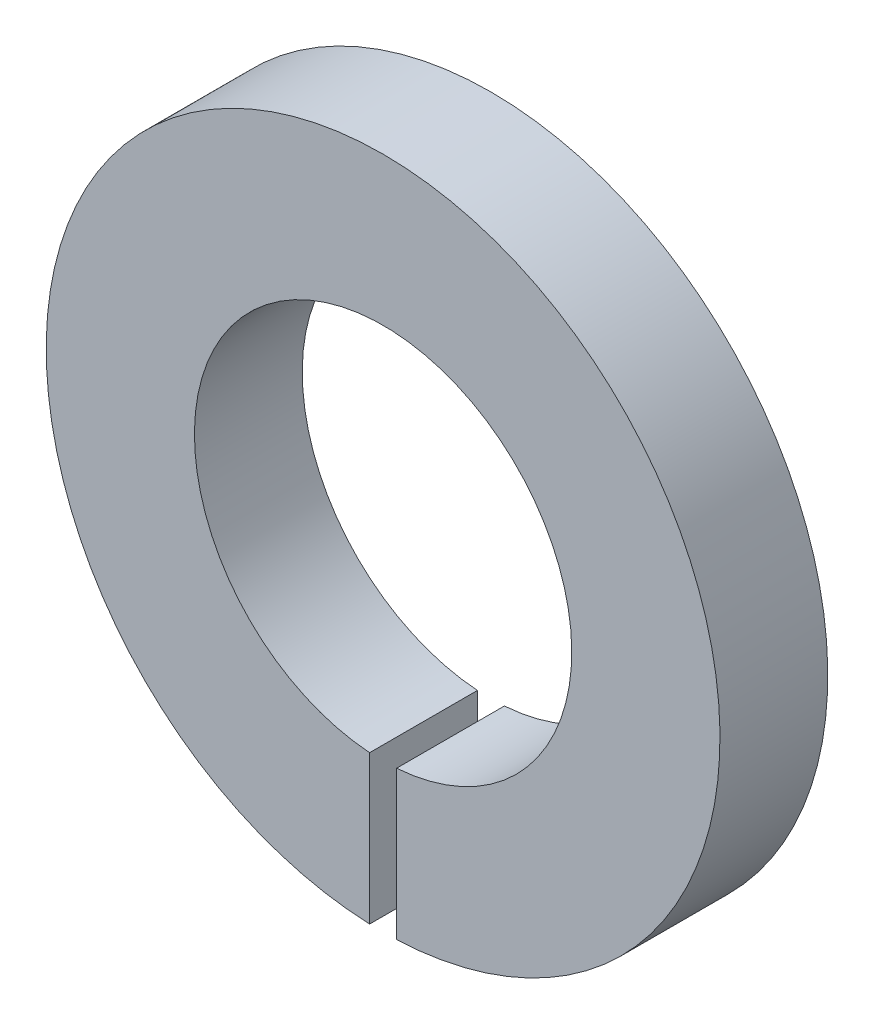
ISO-10303-21;
HEADER;
FILE_DESCRIPTION(('STEP AP214'),'2;1');
FILE_NAME('part.step','',(''),(''),'','','');
FILE_SCHEMA(('AUTOMOTIVE_DESIGN { 1 0 10303 214 1 1 1 1 }'));
ENDSEC;
DATA;
#1=APPLICATION_CONTEXT('core data for automotive mechanical design processes');
#2=APPLICATION_PROTOCOL_DEFINITION('international standard','automotive_design',2000,#1);
#3=PRODUCT_CONTEXT('',#1,'mechanical');
#4=PRODUCT('Part','Part','',(#3));
#5=PRODUCT_RELATED_PRODUCT_CATEGORY('part','',(#4));
#6=PRODUCT_DEFINITION_FORMATION('','',#4);
#7=PRODUCT_DEFINITION_CONTEXT('part definition',#1,'design');
#8=PRODUCT_DEFINITION('design','',#6,#7);
#9=PRODUCT_DEFINITION_SHAPE('','',#8);
#10=(LENGTH_UNIT() NAMED_UNIT(*) SI_UNIT(.MILLI.,.METRE.));
#11=(NAMED_UNIT(*) PLANE_ANGLE_UNIT() SI_UNIT($,.RADIAN.));
#12=(NAMED_UNIT(*) SI_UNIT($,.STERADIAN.) SOLID_ANGLE_UNIT());
#13=UNCERTAINTY_MEASURE_WITH_UNIT(LENGTH_MEASURE(1.E-05),#10,'distance_accuracy_value','');
#14=(GEOMETRIC_REPRESENTATION_CONTEXT(3) GLOBAL_UNCERTAINTY_ASSIGNED_CONTEXT((#13)) GLOBAL_UNIT_ASSIGNED_CONTEXT((#10,
#11,#12)) REPRESENTATION_CONTEXT('',''));
#15=CARTESIAN_POINT('',(0.,0.,0.));
#16=DIRECTION('',(0.,0.,1.));
#17=DIRECTION('',(1.,0.,0.));
#18=AXIS2_PLACEMENT_3D('',#15,#16,#17);
#19=CARTESIAN_POINT('',(0.,0.,1.016));
#20=DIRECTION('',(0.,0.,1.));
#21=DIRECTION('',(1.,0.,0.));
#22=AXIS2_PLACEMENT_3D('',#19,#20,#21);
#23=PLANE('',#22);
#24=CARTESIAN_POINT('',(0.,0.,1.016));
#25=DIRECTION('',(0.,0.,-1.));
#26=DIRECTION('',(-1.,0.,0.));
#27=AXIS2_PLACEMENT_3D('',#24,#25,#26);
#28=CIRCLE('',#27,3.175);
#29=CARTESIAN_POINT('',(-0.127,-3.17245898318639,1.016));
#30=VERTEX_POINT('',#29);
#31=CARTESIAN_POINT('',(0.127000000000001,-3.17245898318639,1.016));
#32=VERTEX_POINT('',#31);
#33=EDGE_CURVE('E95',#30,#32,#28,.T.);
#34=ORIENTED_EDGE('',*,*,#33,.F.);
#35=DIRECTION('',(0.,1.,0.));
#36=VECTOR('',#35,1.);
#37=CARTESIAN_POINT('',(-0.127,0.,1.016));
#38=LINE('',#37,#36);
#39=CARTESIAN_POINT('',(-0.127,-1.77345848555866,1.016));
#40=VERTEX_POINT('',#39);
#41=EDGE_CURVE('E64',#30,#40,#38,.T.);
#42=ORIENTED_EDGE('',*,*,#41,.T.);
#43=CARTESIAN_POINT('',(0.,0.,1.016));
#44=DIRECTION('',(0.,0.,-1.));
#45=DIRECTION('',(-1.,0.,0.));
#46=AXIS2_PLACEMENT_3D('',#43,#44,#45);
#47=CIRCLE('',#46,1.778);
#48=CARTESIAN_POINT('',(0.127,-1.77345848555866,1.016));
#49=VERTEX_POINT('',#48);
#50=EDGE_CURVE('E20',#40,#49,#47,.T.);
#51=ORIENTED_EDGE('',*,*,#50,.T.);
#52=DIRECTION('',(0.,1.,0.));
#53=VECTOR('',#52,1.);
#54=CARTESIAN_POINT('',(0.127,-3.175,1.016));
#55=LINE('',#54,#53);
#56=EDGE_CURVE('E62',#32,#49,#55,.T.);
#57=ORIENTED_EDGE('',*,*,#56,.F.);
#58=EDGE_LOOP('',(#34,#42,#51,#57));
#59=FACE_BOUND('',#58,.T.);
#60=ADVANCED_FACE('F17',(#59),#23,.T.);
#61=CARTESIAN_POINT('',(0.,0.,1.016));
#62=DIRECTION('',(0.,0.,-1.));
#63=DIRECTION('',(-1.,0.,0.));
#64=AXIS2_PLACEMENT_3D('',#61,#62,#63);
#65=CYLINDRICAL_SURFACE('',#64,1.778);
#66=ORIENTED_EDGE('',*,*,#50,.F.);
#67=DIRECTION('',(0.,0.,1.));
#68=VECTOR('',#67,1.);
#69=CARTESIAN_POINT('',(-0.127000000000001,-1.77345848555866,1.016));
#70=LINE('',#69,#68);
#71=CARTESIAN_POINT('',(-0.127,-1.77345848555866,0.));
#72=VERTEX_POINT('',#71);
#73=EDGE_CURVE('E97',#72,#40,#70,.T.);
#74=ORIENTED_EDGE('',*,*,#73,.F.);
#75=CARTESIAN_POINT('',(0.,0.,0.));
#76=DIRECTION('',(0.,0.,-1.));
#77=DIRECTION('',(-1.,0.,0.));
#78=AXIS2_PLACEMENT_3D('',#75,#76,#77);
#79=CIRCLE('',#78,1.778);
#80=CARTESIAN_POINT('',(0.127,-1.77345848555866,0.));
#81=VERTEX_POINT('',#80);
#82=EDGE_CURVE('E80',#72,#81,#79,.T.);
#83=ORIENTED_EDGE('',*,*,#82,.T.);
#84=DIRECTION('',(0.,0.,1.));
#85=VECTOR('',#84,1.);
#86=CARTESIAN_POINT('',(0.127,-1.77345848555866,1.016));
#87=LINE('',#86,#85);
#88=EDGE_CURVE('E70',#49,#81,#87,.F.);
#89=ORIENTED_EDGE('',*,*,#88,.F.);
#90=EDGE_LOOP('',(#66,#74,#83,#89));
#91=FACE_BOUND('',#90,.T.);
#92=ADVANCED_FACE('F79',(#91),#65,.F.);
#93=CARTESIAN_POINT('',(0.127,-3.175,1.016));
#94=DIRECTION('',(-1.,0.,0.));
#95=DIRECTION('',(0.,0.,1.));
#96=AXIS2_PLACEMENT_3D('',#93,#94,#95);
#97=PLANE('',#96);
#98=DIRECTION('',(0.,0.,-1.));
#99=VECTOR('',#98,1.);
#100=CARTESIAN_POINT('',(0.127000000000001,-3.17245898318639,1.016));
#101=LINE('',#100,#99);
#102=CARTESIAN_POINT('',(0.127000000000001,-3.17245898318639,0.));
#103=VERTEX_POINT('',#102);
#104=EDGE_CURVE('E76',#32,#103,#101,.T.);
#105=ORIENTED_EDGE('',*,*,#104,.F.);
#106=ORIENTED_EDGE('',*,*,#56,.T.);
#107=ORIENTED_EDGE('',*,*,#88,.T.);
#108=DIRECTION('',(0.,1.,0.));
#109=VECTOR('',#108,1.);
#110=CARTESIAN_POINT('',(0.127,0.,0.));
#111=LINE('',#110,#109);
#112=EDGE_CURVE('E92',#81,#103,#111,.F.);
#113=ORIENTED_EDGE('',*,*,#112,.T.);
#114=EDGE_LOOP('',(#105,#106,#107,#113));
#115=FACE_BOUND('',#114,.T.);
#116=ADVANCED_FACE('F73',(#115),#97,.T.);
#117=CARTESIAN_POINT('',(0.,0.,1.016));
#118=DIRECTION('',(0.,0.,-1.));
#119=DIRECTION('',(-1.,0.,0.));
#120=AXIS2_PLACEMENT_3D('',#117,#118,#119);
#121=CYLINDRICAL_SURFACE('',#120,3.175);
#122=CARTESIAN_POINT('',(0.,0.,0.));
#123=DIRECTION('',(0.,0.,-1.));
#124=DIRECTION('',(-1.,0.,0.));
#125=AXIS2_PLACEMENT_3D('',#122,#123,#124);
#126=CIRCLE('',#125,3.175);
#127=CARTESIAN_POINT('',(-0.127,-3.17245898318639,0.));
#128=VERTEX_POINT('',#127);
#129=EDGE_CURVE('E27',#103,#128,#126,.F.);
#130=ORIENTED_EDGE('',*,*,#129,.T.);
#131=DIRECTION('',(0.,0.,1.));
#132=VECTOR('',#131,1.);
#133=CARTESIAN_POINT('',(-0.127,-3.17245898318639,1.016));
#134=LINE('',#133,#132);
#135=EDGE_CURVE('E94',#30,#128,#134,.F.);
#136=ORIENTED_EDGE('',*,*,#135,.F.);
#137=ORIENTED_EDGE('',*,*,#33,.T.);
#138=ORIENTED_EDGE('',*,*,#104,.T.);
#139=EDGE_LOOP('',(#130,#136,#137,#138));
#140=FACE_BOUND('',#139,.T.);
#141=ADVANCED_FACE('F99',(#140),#121,.T.);
#142=CARTESIAN_POINT('',(-0.127,-3.175,1.016));
#143=DIRECTION('',(1.,0.,0.));
#144=DIRECTION('',(0.,1.,0.));
#145=AXIS2_PLACEMENT_3D('',#142,#143,#144);
#146=PLANE('',#145);
#147=ORIENTED_EDGE('',*,*,#135,.T.);
#148=DIRECTION('',(0.,1.,0.));
#149=VECTOR('',#148,1.);
#150=CARTESIAN_POINT('',(-0.127,0.,0.));
#151=LINE('',#150,#149);
#152=EDGE_CURVE('E11',#128,#72,#151,.T.);
#153=ORIENTED_EDGE('',*,*,#152,.T.);
#154=ORIENTED_EDGE('',*,*,#73,.T.);
#155=ORIENTED_EDGE('',*,*,#41,.F.);
#156=EDGE_LOOP('',(#147,#153,#154,#155));
#157=FACE_BOUND('',#156,.T.);
#158=ADVANCED_FACE('F106',(#157),#146,.T.);
#159=CARTESIAN_POINT('',(0.,0.,0.));
#160=DIRECTION('',(0.,0.,1.));
#161=DIRECTION('',(1.,0.,0.));
#162=AXIS2_PLACEMENT_3D('',#159,#160,#161);
#163=PLANE('',#162);
#164=ORIENTED_EDGE('',*,*,#152,.F.);
#165=ORIENTED_EDGE('',*,*,#129,.F.);
#166=ORIENTED_EDGE('',*,*,#112,.F.);
#167=ORIENTED_EDGE('',*,*,#82,.F.);
#168=EDGE_LOOP('',(#164,#165,#166,#167));
#169=FACE_BOUND('',#168,.T.);
#170=ADVANCED_FACE('F102',(#169),#163,.F.);
#171=CLOSED_SHELL('',(#60,#92,#116,#141,#158,#170));
#172=MANIFOLD_SOLID_BREP('B1',#171);
#173=ADVANCED_BREP_SHAPE_REPRESENTATION('',(#18,#172),#14);
#174=SHAPE_DEFINITION_REPRESENTATION(#9,#173);
ENDSEC;
END-ISO-10303-21;
